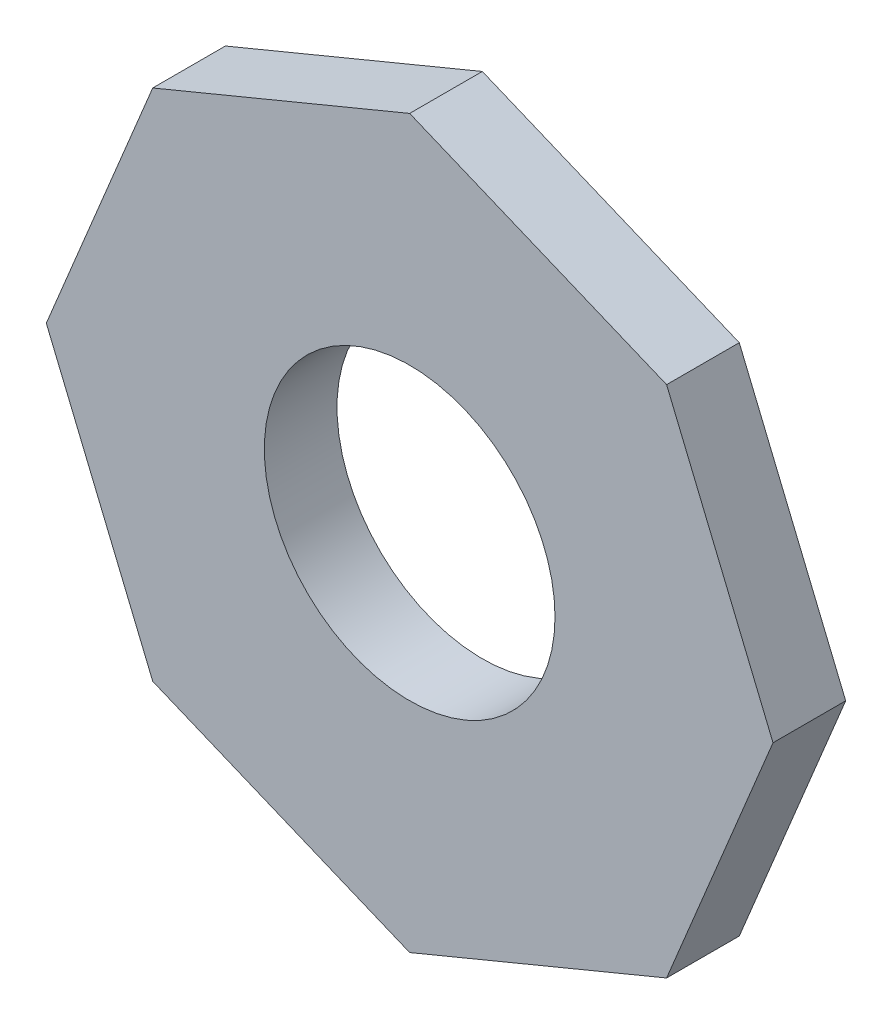
ISO-10303-21;
HEADER;
FILE_DESCRIPTION(('STEP AP214'),'2;1');
FILE_NAME('part.step','',(''),(''),'','','');
FILE_SCHEMA(('AUTOMOTIVE_DESIGN { 1 0 10303 214 1 1 1 1 }'));
ENDSEC;
DATA;
#1=APPLICATION_CONTEXT('core data for automotive mechanical design processes');
#2=APPLICATION_PROTOCOL_DEFINITION('international standard','automotive_design',2000,#1);
#3=PRODUCT_CONTEXT('',#1,'mechanical');
#4=PRODUCT('Part','Part','',(#3));
#5=PRODUCT_RELATED_PRODUCT_CATEGORY('part','',(#4));
#6=PRODUCT_DEFINITION_FORMATION('','',#4);
#7=PRODUCT_DEFINITION_CONTEXT('part definition',#1,'design');
#8=PRODUCT_DEFINITION('design','',#6,#7);
#9=PRODUCT_DEFINITION_SHAPE('','',#8);
#10=(LENGTH_UNIT() NAMED_UNIT(*) SI_UNIT(.MILLI.,.METRE.));
#11=(NAMED_UNIT(*) PLANE_ANGLE_UNIT() SI_UNIT($,.RADIAN.));
#12=(NAMED_UNIT(*) SI_UNIT($,.STERADIAN.) SOLID_ANGLE_UNIT());
#13=UNCERTAINTY_MEASURE_WITH_UNIT(LENGTH_MEASURE(1.E-05),#10,'distance_accuracy_value','');
#14=(GEOMETRIC_REPRESENTATION_CONTEXT(3) GLOBAL_UNCERTAINTY_ASSIGNED_CONTEXT((#13)) GLOBAL_UNIT_ASSIGNED_CONTEXT((#10,
#11,#12)) REPRESENTATION_CONTEXT('',''));
#15=CARTESIAN_POINT('',(0.,0.,0.));
#16=DIRECTION('',(0.,0.,1.));
#17=DIRECTION('',(1.,0.,0.));
#18=AXIS2_PLACEMENT_3D('',#15,#16,#17);
#19=CARTESIAN_POINT('',(353.553390593276,-353.553390593271,100.));
#20=DIRECTION('',(-0.923879532511289,0.382683432365084,0.));
#21=DIRECTION('',(-0.382683432365084,-0.923879532511289,0.));
#22=AXIS2_PLACEMENT_3D('',#19,#20,#21);
#23=PLANE('',#22);
#24=DIRECTION('',(0.382683432365084,0.923879532511289,0.));
#25=VECTOR('',#24,1.);
#26=CARTESIAN_POINT('',(353.553390593276,-353.553390593271,0.));
#27=LINE('',#26,#25);
#28=CARTESIAN_POINT('',(353.553390593276,-353.553390593271,0.));
#29=VERTEX_POINT('',#28);
#30=CARTESIAN_POINT('',(500.,3.21964677141295E-12,0.));
#31=VERTEX_POINT('',#30);
#32=EDGE_CURVE('E137',#29,#31,#27,.T.);
#33=ORIENTED_EDGE('',*,*,#32,.T.);
#34=DIRECTION('',(0.,0.,-1.));
#35=VECTOR('',#34,1.);
#36=CARTESIAN_POINT('',(500.,3.21964677141295E-12,100.));
#37=LINE('',#36,#35);
#38=CARTESIAN_POINT('',(500.,3.21964677141295E-12,100.));
#39=VERTEX_POINT('',#38);
#40=EDGE_CURVE('E11',#39,#31,#37,.T.);
#41=ORIENTED_EDGE('',*,*,#40,.F.);
#42=DIRECTION('',(0.382683432365084,0.923879532511289,0.));
#43=VECTOR('',#42,1.);
#44=CARTESIAN_POINT('',(353.553390593276,-353.553390593271,100.));
#45=LINE('',#44,#43);
#46=CARTESIAN_POINT('',(353.553390593276,-353.553390593271,100.));
#47=VERTEX_POINT('',#46);
#48=EDGE_CURVE('E152',#47,#39,#45,.T.);
#49=ORIENTED_EDGE('',*,*,#48,.F.);
#50=DIRECTION('',(0.,0.,-1.));
#51=VECTOR('',#50,1.);
#52=CARTESIAN_POINT('',(353.553390593276,-353.553390593271,100.));
#53=LINE('',#52,#51);
#54=EDGE_CURVE('E133',#47,#29,#53,.T.);
#55=ORIENTED_EDGE('',*,*,#54,.T.);
#56=EDGE_LOOP('',(#33,#41,#49,#55));
#57=FACE_BOUND('',#56,.T.);
#58=ADVANCED_FACE('F41',(#57),#23,.F.);
#59=CARTESIAN_POINT('',(500.,3.21964677141295E-12,100.));
#60=DIRECTION('',(-0.923879532511284,-0.382683432365096,0.));
#61=DIRECTION('',(0.382683432365096,-0.923879532511284,0.));
#62=AXIS2_PLACEMENT_3D('',#59,#60,#61);
#63=PLANE('',#62);
#64=DIRECTION('',(-0.382683432365096,0.923879532511284,0.));
#65=VECTOR('',#64,1.);
#66=CARTESIAN_POINT('',(500.,3.21964677141295E-12,0.));
#67=LINE('',#66,#65);
#68=CARTESIAN_POINT('',(353.553390593272,353.553390593276,0.));
#69=VERTEX_POINT('',#68);
#70=EDGE_CURVE('E140',#31,#69,#67,.T.);
#71=ORIENTED_EDGE('',*,*,#70,.T.);
#72=DIRECTION('',(0.,0.,-1.));
#73=VECTOR('',#72,1.);
#74=CARTESIAN_POINT('',(353.553390593272,353.553390593276,100.));
#75=LINE('',#74,#73);
#76=CARTESIAN_POINT('',(353.553390593272,353.553390593276,100.));
#77=VERTEX_POINT('',#76);
#78=EDGE_CURVE('E49',#77,#69,#75,.T.);
#79=ORIENTED_EDGE('',*,*,#78,.F.);
#80=DIRECTION('',(-0.382683432365096,0.923879532511284,0.));
#81=VECTOR('',#80,1.);
#82=CARTESIAN_POINT('',(500.,3.21964677141295E-12,100.));
#83=LINE('',#82,#81);
#84=EDGE_CURVE('E100',#39,#77,#83,.T.);
#85=ORIENTED_EDGE('',*,*,#84,.F.);
#86=ORIENTED_EDGE('',*,*,#40,.T.);
#87=EDGE_LOOP('',(#71,#79,#85,#86));
#88=FACE_BOUND('',#87,.T.);
#89=ADVANCED_FACE('F206',(#88),#63,.F.);
#90=CARTESIAN_POINT('',(353.553390593272,353.553390593276,100.));
#91=DIRECTION('',(-0.382683432365084,-0.923879532511289,0.));
#92=DIRECTION('',(0.923879532511289,-0.382683432365084,0.));
#93=AXIS2_PLACEMENT_3D('',#90,#91,#92);
#94=PLANE('',#93);
#95=DIRECTION('',(-0.923879532511289,0.382683432365084,0.));
#96=VECTOR('',#95,1.);
#97=CARTESIAN_POINT('',(353.553390593272,353.553390593276,0.));
#98=LINE('',#97,#96);
#99=CARTESIAN_POINT('',(-3.10862446895044E-12,500.,0.));
#100=VERTEX_POINT('',#99);
#101=EDGE_CURVE('E143',#69,#100,#98,.T.);
#102=ORIENTED_EDGE('',*,*,#101,.T.);
#103=DIRECTION('',(0.,0.,-1.));
#104=VECTOR('',#103,1.);
#105=CARTESIAN_POINT('',(-3.10862446895044E-12,500.,100.));
#106=LINE('',#105,#104);
#107=CARTESIAN_POINT('',(-3.10862446895044E-12,500.,100.));
#108=VERTEX_POINT('',#107);
#109=EDGE_CURVE('E159',#108,#100,#106,.T.);
#110=ORIENTED_EDGE('',*,*,#109,.F.);
#111=DIRECTION('',(-0.923879532511289,0.382683432365084,0.));
#112=VECTOR('',#111,1.);
#113=CARTESIAN_POINT('',(353.553390593272,353.553390593276,100.));
#114=LINE('',#113,#112);
#115=EDGE_CURVE('E167',#77,#108,#114,.T.);
#116=ORIENTED_EDGE('',*,*,#115,.F.);
#117=ORIENTED_EDGE('',*,*,#78,.T.);
#118=EDGE_LOOP('',(#102,#110,#116,#117));
#119=FACE_BOUND('',#118,.T.);
#120=ADVANCED_FACE('F165',(#119),#94,.F.);
#121=CARTESIAN_POINT('',(-3.10862446895044E-12,500.,100.));
#122=DIRECTION('',(0.382683432365096,-0.923879532511284,0.));
#123=DIRECTION('',(0.923879532511284,0.382683432365096,0.));
#124=AXIS2_PLACEMENT_3D('',#121,#122,#123);
#125=PLANE('',#124);
#126=DIRECTION('',(-0.923879532511284,-0.382683432365096,0.));
#127=VECTOR('',#126,1.);
#128=CARTESIAN_POINT('',(-3.10862446895044E-12,500.,0.));
#129=LINE('',#128,#127);
#130=CARTESIAN_POINT('',(-353.553390593276,353.553390593271,0.));
#131=VERTEX_POINT('',#130);
#132=EDGE_CURVE('E145',#100,#131,#129,.T.);
#133=ORIENTED_EDGE('',*,*,#132,.T.);
#134=DIRECTION('',(0.,0.,-1.));
#135=VECTOR('',#134,1.);
#136=CARTESIAN_POINT('',(-353.553390593276,353.553390593271,100.));
#137=LINE('',#136,#135);
#138=CARTESIAN_POINT('',(-353.553390593276,353.553390593271,100.));
#139=VERTEX_POINT('',#138);
#140=EDGE_CURVE('E156',#139,#131,#137,.T.);
#141=ORIENTED_EDGE('',*,*,#140,.F.);
#142=DIRECTION('',(-0.923879532511284,-0.382683432365096,0.));
#143=VECTOR('',#142,1.);
#144=CARTESIAN_POINT('',(-3.10862446895044E-12,500.,100.));
#145=LINE('',#144,#143);
#146=EDGE_CURVE('E179',#108,#139,#145,.T.);
#147=ORIENTED_EDGE('',*,*,#146,.F.);
#148=ORIENTED_EDGE('',*,*,#109,.T.);
#149=EDGE_LOOP('',(#133,#141,#147,#148));
#150=FACE_BOUND('',#149,.T.);
#151=ADVANCED_FACE('F175',(#150),#125,.F.);
#152=CARTESIAN_POINT('',(-353.553390593276,353.553390593271,100.));
#153=DIRECTION('',(0.923879532511289,-0.382683432365084,0.));
#154=DIRECTION('',(0.382683432365084,0.923879532511289,0.));
#155=AXIS2_PLACEMENT_3D('',#152,#153,#154);
#156=PLANE('',#155);
#157=DIRECTION('',(-0.382683432365084,-0.923879532511289,0.));
#158=VECTOR('',#157,1.);
#159=CARTESIAN_POINT('',(-353.553390593276,353.553390593271,0.));
#160=LINE('',#159,#158);
#161=CARTESIAN_POINT('',(-500.,-3.49148133884313E-12,0.));
#162=VERTEX_POINT('',#161);
#163=EDGE_CURVE('E147',#131,#162,#160,.T.);
#164=ORIENTED_EDGE('',*,*,#163,.T.);
#165=DIRECTION('',(0.,0.,-1.));
#166=VECTOR('',#165,1.);
#167=CARTESIAN_POINT('',(-500.,-3.49148133884313E-12,100.));
#168=LINE('',#167,#166);
#169=CARTESIAN_POINT('',(-500.,-3.49148133884313E-12,100.));
#170=VERTEX_POINT('',#169);
#171=EDGE_CURVE('E128',#170,#162,#168,.T.);
#172=ORIENTED_EDGE('',*,*,#171,.F.);
#173=DIRECTION('',(-0.382683432365084,-0.923879532511289,0.));
#174=VECTOR('',#173,1.);
#175=CARTESIAN_POINT('',(-353.553390593276,353.553390593271,100.));
#176=LINE('',#175,#174);
#177=EDGE_CURVE('E119',#139,#170,#176,.T.);
#178=ORIENTED_EDGE('',*,*,#177,.F.);
#179=ORIENTED_EDGE('',*,*,#140,.T.);
#180=EDGE_LOOP('',(#164,#172,#178,#179));
#181=FACE_BOUND('',#180,.T.);
#182=ADVANCED_FACE('F178',(#181),#156,.F.);
#183=CARTESIAN_POINT('',(-500.,-3.49148133884313E-12,100.));
#184=DIRECTION('',(0.923879532511284,0.382683432365096,0.));
#185=DIRECTION('',(-0.382683432365096,0.923879532511284,0.));
#186=AXIS2_PLACEMENT_3D('',#183,#184,#185);
#187=PLANE('',#186);
#188=DIRECTION('',(0.382683432365096,-0.923879532511284,0.));
#189=VECTOR('',#188,1.);
#190=CARTESIAN_POINT('',(-500.,-3.49148133884313E-12,0.));
#191=LINE('',#190,#189);
#192=CARTESIAN_POINT('',(-353.553390593271,-353.553390593276,0.));
#193=VERTEX_POINT('',#192);
#194=EDGE_CURVE('E127',#162,#193,#191,.T.);
#195=ORIENTED_EDGE('',*,*,#194,.T.);
#196=DIRECTION('',(0.,0.,-1.));
#197=VECTOR('',#196,1.);
#198=CARTESIAN_POINT('',(-353.553390593271,-353.553390593276,100.));
#199=LINE('',#198,#197);
#200=CARTESIAN_POINT('',(-353.553390593271,-353.553390593276,100.));
#201=VERTEX_POINT('',#200);
#202=EDGE_CURVE('E124',#201,#193,#199,.T.);
#203=ORIENTED_EDGE('',*,*,#202,.F.);
#204=DIRECTION('',(0.382683432365096,-0.923879532511284,0.));
#205=VECTOR('',#204,1.);
#206=CARTESIAN_POINT('',(-500.,-3.49148133884313E-12,100.));
#207=LINE('',#206,#205);
#208=EDGE_CURVE('E113',#170,#201,#207,.T.);
#209=ORIENTED_EDGE('',*,*,#208,.F.);
#210=ORIENTED_EDGE('',*,*,#171,.T.);
#211=EDGE_LOOP('',(#195,#203,#209,#210));
#212=FACE_BOUND('',#211,.T.);
#213=ADVANCED_FACE('F125',(#212),#187,.F.);
#214=CARTESIAN_POINT('',(-353.553390593271,-353.553390593276,100.));
#215=DIRECTION('',(0.382683432365084,0.923879532511289,0.));
#216=DIRECTION('',(-0.923879532511289,0.382683432365084,0.));
#217=AXIS2_PLACEMENT_3D('',#214,#215,#216);
#218=PLANE('',#217);
#219=DIRECTION('',(0.923879532511289,-0.382683432365084,0.));
#220=VECTOR('',#219,1.);
#221=CARTESIAN_POINT('',(-353.553390593271,-353.553390593276,0.));
#222=LINE('',#221,#220);
#223=CARTESIAN_POINT('',(3.31652195846375E-12,-500.,0.));
#224=VERTEX_POINT('',#223);
#225=EDGE_CURVE('E86',#193,#224,#222,.T.);
#226=ORIENTED_EDGE('',*,*,#225,.T.);
#227=DIRECTION('',(0.,0.,-1.));
#228=VECTOR('',#227,1.);
#229=CARTESIAN_POINT('',(3.31652195846375E-12,-500.,100.));
#230=LINE('',#229,#228);
#231=CARTESIAN_POINT('',(3.31652195846375E-12,-500.,100.));
#232=VERTEX_POINT('',#231);
#233=EDGE_CURVE('E129',#232,#224,#230,.T.);
#234=ORIENTED_EDGE('',*,*,#233,.F.);
#235=DIRECTION('',(0.923879532511289,-0.382683432365084,0.));
#236=VECTOR('',#235,1.);
#237=CARTESIAN_POINT('',(-353.553390593271,-353.553390593276,100.));
#238=LINE('',#237,#236);
#239=EDGE_CURVE('E117',#201,#232,#238,.T.);
#240=ORIENTED_EDGE('',*,*,#239,.F.);
#241=ORIENTED_EDGE('',*,*,#202,.T.);
#242=EDGE_LOOP('',(#226,#234,#240,#241));
#243=FACE_BOUND('',#242,.T.);
#244=ADVANCED_FACE('F131',(#243),#218,.F.);
#245=CARTESIAN_POINT('',(3.31652195846375E-12,-500.,100.));
#246=DIRECTION('',(-0.382683432365096,0.923879532511284,0.));
#247=DIRECTION('',(-0.923879532511284,-0.382683432365096,0.));
#248=AXIS2_PLACEMENT_3D('',#245,#246,#247);
#249=PLANE('',#248);
#250=DIRECTION('',(0.923879532511284,0.382683432365096,0.));
#251=VECTOR('',#250,1.);
#252=CARTESIAN_POINT('',(3.31652195846375E-12,-500.,0.));
#253=LINE('',#252,#251);
#254=EDGE_CURVE('E92',#224,#29,#253,.T.);
#255=ORIENTED_EDGE('',*,*,#254,.T.);
#256=ORIENTED_EDGE('',*,*,#54,.F.);
#257=DIRECTION('',(0.923879532511284,0.382683432365096,0.));
#258=VECTOR('',#257,1.);
#259=CARTESIAN_POINT('',(3.31652195846375E-12,-500.,100.));
#260=LINE('',#259,#258);
#261=EDGE_CURVE('E57',#232,#47,#260,.T.);
#262=ORIENTED_EDGE('',*,*,#261,.F.);
#263=ORIENTED_EDGE('',*,*,#233,.T.);
#264=EDGE_LOOP('',(#255,#256,#262,#263));
#265=FACE_BOUND('',#264,.T.);
#266=ADVANCED_FACE('F195',(#265),#249,.F.);
#267=CARTESIAN_POINT('',(0.,0.,100.));
#268=DIRECTION('',(0.,0.,1.));
#269=DIRECTION('',(1.,0.,0.));
#270=AXIS2_PLACEMENT_3D('',#267,#268,#269);
#271=PLANE('',#270);
#272=CARTESIAN_POINT('',(0.,0.,100.));
#273=DIRECTION('',(0.,0.,1.));
#274=DIRECTION('',(1.,0.,0.));
#275=AXIS2_PLACEMENT_3D('',#272,#273,#274);
#276=CIRCLE('',#275,200.);
#277=CARTESIAN_POINT('',(200.,0.,100.));
#278=VERTEX_POINT('',#277);
#279=EDGE_CURVE('E141',#278,#278,#276,.T.);
#280=ORIENTED_EDGE('',*,*,#279,.F.);
#281=EDGE_LOOP('',(#280));
#282=FACE_BOUND('',#281,.T.);
#283=ORIENTED_EDGE('',*,*,#48,.T.);
#284=ORIENTED_EDGE('',*,*,#84,.T.);
#285=ORIENTED_EDGE('',*,*,#115,.T.);
#286=ORIENTED_EDGE('',*,*,#146,.T.);
#287=ORIENTED_EDGE('',*,*,#177,.T.);
#288=ORIENTED_EDGE('',*,*,#208,.T.);
#289=ORIENTED_EDGE('',*,*,#239,.T.);
#290=ORIENTED_EDGE('',*,*,#261,.T.);
#291=EDGE_LOOP('',(#283,#284,#285,#286,#287,#288,#289,#290));
#292=FACE_BOUND('',#291,.T.);
#293=ADVANCED_FACE('F115',(#282,#292),#271,.T.);
#294=CARTESIAN_POINT('',(0.,0.,0.));
#295=DIRECTION('',(0.,0.,1.));
#296=DIRECTION('',(1.,0.,0.));
#297=AXIS2_PLACEMENT_3D('',#294,#295,#296);
#298=PLANE('',#297);
#299=CARTESIAN_POINT('',(0.,0.,0.));
#300=DIRECTION('',(0.,0.,1.));
#301=DIRECTION('',(1.,0.,0.));
#302=AXIS2_PLACEMENT_3D('',#299,#300,#301);
#303=CIRCLE('',#302,200.);
#304=CARTESIAN_POINT('',(200.,0.,0.));
#305=VERTEX_POINT('',#304);
#306=EDGE_CURVE('E185',#305,#305,#303,.T.);
#307=ORIENTED_EDGE('',*,*,#306,.T.);
#308=EDGE_LOOP('',(#307));
#309=FACE_BOUND('',#308,.T.);
#310=ORIENTED_EDGE('',*,*,#32,.F.);
#311=ORIENTED_EDGE('',*,*,#254,.F.);
#312=ORIENTED_EDGE('',*,*,#225,.F.);
#313=ORIENTED_EDGE('',*,*,#194,.F.);
#314=ORIENTED_EDGE('',*,*,#163,.F.);
#315=ORIENTED_EDGE('',*,*,#132,.F.);
#316=ORIENTED_EDGE('',*,*,#101,.F.);
#317=ORIENTED_EDGE('',*,*,#70,.F.);
#318=EDGE_LOOP('',(#310,#311,#312,#313,#314,#315,#316,#317));
#319=FACE_BOUND('',#318,.T.);
#320=ADVANCED_FACE('F171',(#309,#319),#298,.F.);
#321=CARTESIAN_POINT('',(0.,0.,100.));
#322=DIRECTION('',(0.,0.,-1.));
#323=DIRECTION('',(-1.,0.,0.));
#324=AXIS2_PLACEMENT_3D('',#321,#322,#323);
#325=CYLINDRICAL_SURFACE('',#324,200.);
#326=ORIENTED_EDGE('',*,*,#279,.T.);
#327=EDGE_LOOP('',(#326));
#328=FACE_BOUND('',#327,.T.);
#329=ORIENTED_EDGE('',*,*,#306,.F.);
#330=EDGE_LOOP('',(#329));
#331=FACE_BOUND('',#330,.T.);
#332=ADVANCED_FACE('F191',(#328,#331),#325,.F.);
#333=CLOSED_SHELL('',(#58,#89,#120,#151,#182,#213,#244,#266,#293,#320,#332));
#334=MANIFOLD_SOLID_BREP('B2',#333);
#335=ADVANCED_BREP_SHAPE_REPRESENTATION('',(#18,#334),#14);
#336=SHAPE_DEFINITION_REPRESENTATION(#9,#335);
ENDSEC;
END-ISO-10303-21;
